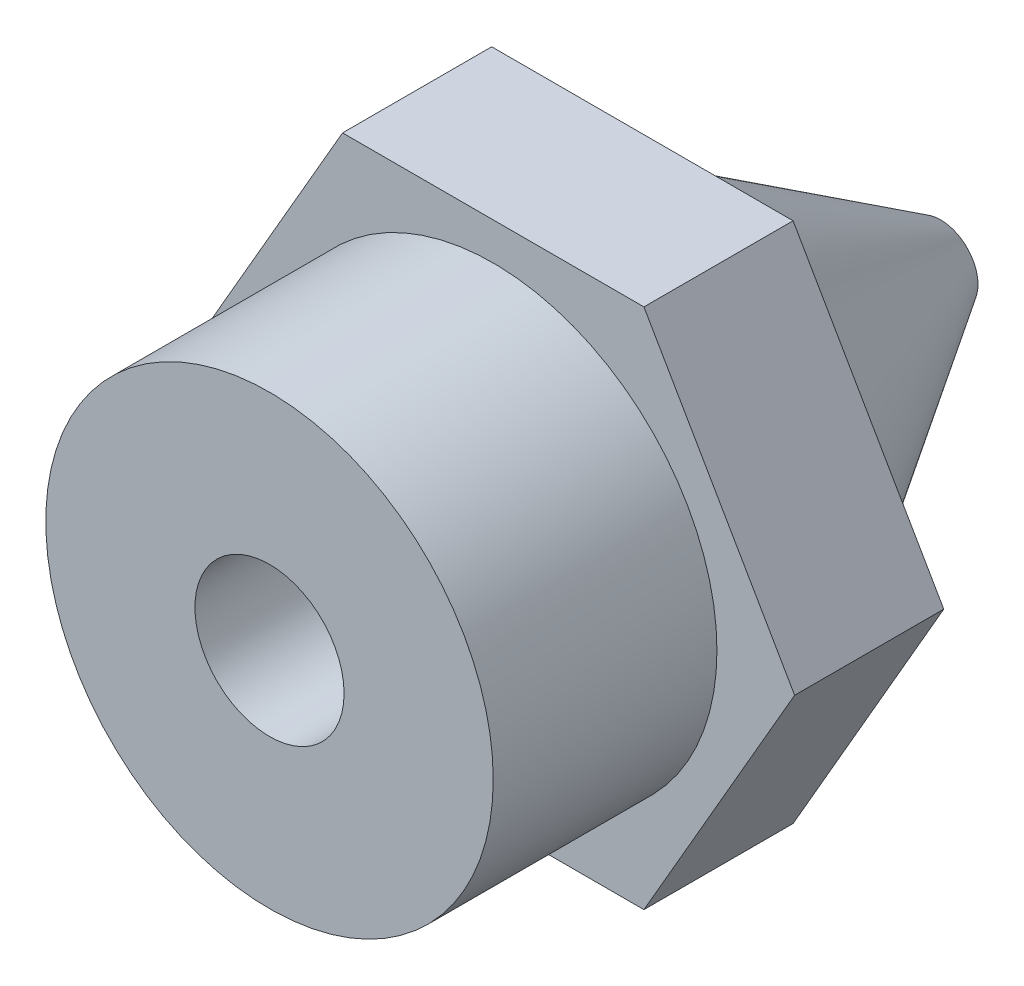
ISO-10303-21;
HEADER;
FILE_DESCRIPTION(('STEP AP214'),'2;1');
FILE_NAME('part.step','',(''),(''),'','','');
FILE_SCHEMA(('AUTOMOTIVE_DESIGN { 1 0 10303 214 1 1 1 1 }'));
ENDSEC;
DATA;
#1=APPLICATION_CONTEXT('core data for automotive mechanical design processes');
#2=APPLICATION_PROTOCOL_DEFINITION('international standard','automotive_design',2000,#1);
#3=PRODUCT_CONTEXT('',#1,'mechanical');
#4=PRODUCT('Part','Part','',(#3));
#5=PRODUCT_RELATED_PRODUCT_CATEGORY('part','',(#4));
#6=PRODUCT_DEFINITION_FORMATION('','',#4);
#7=PRODUCT_DEFINITION_CONTEXT('part definition',#1,'design');
#8=PRODUCT_DEFINITION('design','',#6,#7);
#9=PRODUCT_DEFINITION_SHAPE('','',#8);
#10=(LENGTH_UNIT() NAMED_UNIT(*) SI_UNIT(.MILLI.,.METRE.));
#11=(NAMED_UNIT(*) PLANE_ANGLE_UNIT() SI_UNIT($,.RADIAN.));
#12=(NAMED_UNIT(*) SI_UNIT($,.STERADIAN.) SOLID_ANGLE_UNIT());
#13=UNCERTAINTY_MEASURE_WITH_UNIT(LENGTH_MEASURE(1.E-05),#10,'distance_accuracy_value','');
#14=(GEOMETRIC_REPRESENTATION_CONTEXT(3) GLOBAL_UNCERTAINTY_ASSIGNED_CONTEXT((#13)) GLOBAL_UNIT_ASSIGNED_CONTEXT((#10,
#11,#12)) REPRESENTATION_CONTEXT('',''));
#15=CARTESIAN_POINT('',(0.,0.,0.));
#16=DIRECTION('',(0.,0.,1.));
#17=DIRECTION('',(1.,0.,0.));
#18=AXIS2_PLACEMENT_3D('',#15,#16,#17);
#19=CARTESIAN_POINT('',(2.02072594216368,3.50000000000001,9.));
#20=DIRECTION('',(0.,-1.,0.));
#21=DIRECTION('',(1.,0.,0.));
#22=AXIS2_PLACEMENT_3D('',#19,#20,#21);
#23=PLANE('',#22);
#24=DIRECTION('',(1.,0.,0.));
#25=VECTOR('',#24,1.);
#26=CARTESIAN_POINT('',(2.02072594216368,3.50000000000001,4.));
#27=LINE('',#26,#25);
#28=CARTESIAN_POINT('',(-2.02072594216371,3.49999999999999,4.));
#29=VERTEX_POINT('',#28);
#30=CARTESIAN_POINT('',(2.02072594216368,3.50000000000001,4.));
#31=VERTEX_POINT('',#30);
#32=EDGE_CURVE('E49',#29,#31,#27,.T.);
#33=ORIENTED_EDGE('',*,*,#32,.F.);
#34=DIRECTION('',(0.,0.,-1.));
#35=VECTOR('',#34,1.);
#36=CARTESIAN_POINT('',(-2.02072594216371,3.49999999999999,9.));
#37=LINE('',#36,#35);
#38=CARTESIAN_POINT('',(-2.02072594216371,3.49999999999999,6.));
#39=VERTEX_POINT('',#38);
#40=EDGE_CURVE('E117',#39,#29,#37,.T.);
#41=ORIENTED_EDGE('',*,*,#40,.F.);
#42=DIRECTION('',(-1.,0.,0.));
#43=VECTOR('',#42,1.);
#44=CARTESIAN_POINT('',(2.02072594216368,3.50000000000001,6.));
#45=LINE('',#44,#43);
#46=CARTESIAN_POINT('',(2.02072594216368,3.50000000000001,6.));
#47=VERTEX_POINT('',#46);
#48=EDGE_CURVE('E108',#47,#39,#45,.T.);
#49=ORIENTED_EDGE('',*,*,#48,.F.);
#50=DIRECTION('',(0.,0.,-1.));
#51=VECTOR('',#50,1.);
#52=CARTESIAN_POINT('',(2.02072594216368,3.50000000000001,9.));
#53=LINE('',#52,#51);
#54=EDGE_CURVE('E104',#47,#31,#53,.T.);
#55=ORIENTED_EDGE('',*,*,#54,.T.);
#56=EDGE_LOOP('',(#33,#41,#49,#55));
#57=FACE_BOUND('',#56,.T.);
#58=ADVANCED_FACE('F34',(#57),#23,.F.);
#59=CARTESIAN_POINT('',(-2.02072594216371,3.49999999999999,9.));
#60=DIRECTION('',(0.866025403784441,-0.499999999999995,0.));
#61=DIRECTION('',(0.499999999999995,0.866025403784442,0.));
#62=AXIS2_PLACEMENT_3D('',#59,#60,#61);
#63=PLANE('',#62);
#64=DIRECTION('',(0.499999999999995,0.866025403784442,0.));
#65=VECTOR('',#64,1.);
#66=CARTESIAN_POINT('',(-2.02072594216371,3.49999999999999,4.));
#67=LINE('',#66,#65);
#68=CARTESIAN_POINT('',(-4.04145188432738,0.,4.));
#69=VERTEX_POINT('',#68);
#70=EDGE_CURVE('E140',#69,#29,#67,.T.);
#71=ORIENTED_EDGE('',*,*,#70,.F.);
#72=DIRECTION('',(0.,0.,-1.));
#73=VECTOR('',#72,1.);
#74=CARTESIAN_POINT('',(-4.04145188432738,0.,9.));
#75=LINE('',#74,#73);
#76=CARTESIAN_POINT('',(-4.04145188432738,0.,6.));
#77=VERTEX_POINT('',#76);
#78=EDGE_CURVE('E114',#77,#69,#75,.T.);
#79=ORIENTED_EDGE('',*,*,#78,.F.);
#80=DIRECTION('',(-0.499999999999995,-0.866025403784442,0.));
#81=VECTOR('',#80,1.);
#82=CARTESIAN_POINT('',(-2.02072594216371,3.49999999999999,6.));
#83=LINE('',#82,#81);
#84=EDGE_CURVE('E125',#39,#77,#83,.T.);
#85=ORIENTED_EDGE('',*,*,#84,.F.);
#86=ORIENTED_EDGE('',*,*,#40,.T.);
#87=EDGE_LOOP('',(#71,#79,#85,#86));
#88=FACE_BOUND('',#87,.T.);
#89=ADVANCED_FACE('F177',(#88),#63,.F.);
#90=CARTESIAN_POINT('',(-4.04145188432738,0.,9.));
#91=DIRECTION('',(0.866025403784434,0.500000000000007,0.));
#92=DIRECTION('',(-0.500000000000007,0.866025403784435,0.));
#93=AXIS2_PLACEMENT_3D('',#90,#91,#92);
#94=PLANE('',#93);
#95=DIRECTION('',(-0.500000000000007,0.866025403784435,0.));
#96=VECTOR('',#95,1.);
#97=CARTESIAN_POINT('',(-4.04145188432738,0.,4.));
#98=LINE('',#97,#96);
#99=CARTESIAN_POINT('',(-2.02072594216366,-3.50000000000002,4.));
#100=VERTEX_POINT('',#99);
#101=EDGE_CURVE('E142',#100,#69,#98,.T.);
#102=ORIENTED_EDGE('',*,*,#101,.F.);
#103=DIRECTION('',(0.,0.,-1.));
#104=VECTOR('',#103,1.);
#105=CARTESIAN_POINT('',(-2.02072594216366,-3.50000000000002,9.));
#106=LINE('',#105,#104);
#107=CARTESIAN_POINT('',(-2.02072594216366,-3.50000000000002,6.));
#108=VERTEX_POINT('',#107);
#109=EDGE_CURVE('E106',#108,#100,#106,.T.);
#110=ORIENTED_EDGE('',*,*,#109,.F.);
#111=DIRECTION('',(0.500000000000007,-0.866025403784435,0.));
#112=VECTOR('',#111,1.);
#113=CARTESIAN_POINT('',(-4.04145188432738,0.,6.));
#114=LINE('',#113,#112);
#115=EDGE_CURVE('E126',#77,#108,#114,.T.);
#116=ORIENTED_EDGE('',*,*,#115,.F.);
#117=ORIENTED_EDGE('',*,*,#78,.T.);
#118=EDGE_LOOP('',(#102,#110,#116,#117));
#119=FACE_BOUND('',#118,.T.);
#120=ADVANCED_FACE('F181',(#119),#94,.F.);
#121=CARTESIAN_POINT('',(-2.02072594216366,-3.50000000000002,9.));
#122=DIRECTION('',(0.,1.,0.));
#123=DIRECTION('',(-1.,0.,0.));
#124=AXIS2_PLACEMENT_3D('',#121,#122,#123);
#125=PLANE('',#124);
#126=DIRECTION('',(-1.,0.,0.));
#127=VECTOR('',#126,1.);
#128=CARTESIAN_POINT('',(-2.02072594216366,-3.50000000000002,4.));
#129=LINE('',#128,#127);
#130=CARTESIAN_POINT('',(2.02072594216373,-3.49999999999998,4.));
#131=VERTEX_POINT('',#130);
#132=EDGE_CURVE('E100',#131,#100,#129,.T.);
#133=ORIENTED_EDGE('',*,*,#132,.F.);
#134=DIRECTION('',(0.,0.,-1.));
#135=VECTOR('',#134,1.);
#136=CARTESIAN_POINT('',(2.02072594216373,-3.49999999999998,9.));
#137=LINE('',#136,#135);
#138=CARTESIAN_POINT('',(2.02072594216373,-3.49999999999998,6.));
#139=VERTEX_POINT('',#138);
#140=EDGE_CURVE('E99',#139,#131,#137,.T.);
#141=ORIENTED_EDGE('',*,*,#140,.F.);
#142=DIRECTION('',(1.,0.,0.));
#143=VECTOR('',#142,1.);
#144=CARTESIAN_POINT('',(-2.02072594216366,-3.50000000000002,6.));
#145=LINE('',#144,#143);
#146=EDGE_CURVE('E130',#108,#139,#145,.T.);
#147=ORIENTED_EDGE('',*,*,#146,.F.);
#148=ORIENTED_EDGE('',*,*,#109,.T.);
#149=EDGE_LOOP('',(#133,#141,#147,#148));
#150=FACE_BOUND('',#149,.T.);
#151=ADVANCED_FACE('F187',(#150),#125,.F.);
#152=CARTESIAN_POINT('',(2.02072594216373,-3.49999999999998,9.));
#153=DIRECTION('',(-0.866025403784442,0.499999999999995,0.));
#154=DIRECTION('',(-0.499999999999995,-0.866025403784442,0.));
#155=AXIS2_PLACEMENT_3D('',#152,#153,#154);
#156=PLANE('',#155);
#157=DIRECTION('',(-0.499999999999995,-0.866025403784442,0.));
#158=VECTOR('',#157,1.);
#159=CARTESIAN_POINT('',(2.02072594216373,-3.49999999999998,4.));
#160=LINE('',#159,#158);
#161=CARTESIAN_POINT('',(4.04145188432738,0.,4.));
#162=VERTEX_POINT('',#161);
#163=EDGE_CURVE('E86',#162,#131,#160,.T.);
#164=ORIENTED_EDGE('',*,*,#163,.F.);
#165=DIRECTION('',(0.,0.,-1.));
#166=VECTOR('',#165,1.);
#167=CARTESIAN_POINT('',(4.04145188432738,0.,9.));
#168=LINE('',#167,#166);
#169=CARTESIAN_POINT('',(4.04145188432738,0.,6.));
#170=VERTEX_POINT('',#169);
#171=EDGE_CURVE('E97',#170,#162,#168,.T.);
#172=ORIENTED_EDGE('',*,*,#171,.F.);
#173=DIRECTION('',(0.499999999999995,0.866025403784442,0.));
#174=VECTOR('',#173,1.);
#175=CARTESIAN_POINT('',(2.02072594216373,-3.49999999999998,6.));
#176=LINE('',#175,#174);
#177=EDGE_CURVE('E57',#139,#170,#176,.T.);
#178=ORIENTED_EDGE('',*,*,#177,.F.);
#179=ORIENTED_EDGE('',*,*,#140,.T.);
#180=EDGE_LOOP('',(#164,#172,#178,#179));
#181=FACE_BOUND('',#180,.T.);
#182=ADVANCED_FACE('F96',(#181),#156,.F.);
#183=CARTESIAN_POINT('',(4.04145188432738,0.,9.));
#184=DIRECTION('',(-0.866025403784438,-0.500000000000001,0.));
#185=DIRECTION('',(0.500000000000001,-0.866025403784438,0.));
#186=AXIS2_PLACEMENT_3D('',#183,#184,#185);
#187=PLANE('',#186);
#188=DIRECTION('',(0.500000000000001,-0.866025403784438,0.));
#189=VECTOR('',#188,1.);
#190=CARTESIAN_POINT('',(4.04145188432738,0.,4.));
#191=LINE('',#190,#189);
#192=EDGE_CURVE('E42',#31,#162,#191,.T.);
#193=ORIENTED_EDGE('',*,*,#192,.F.);
#194=ORIENTED_EDGE('',*,*,#54,.F.);
#195=DIRECTION('',(-0.500000000000001,0.866025403784438,0.));
#196=VECTOR('',#195,1.);
#197=CARTESIAN_POINT('',(4.04145188432738,0.,6.));
#198=LINE('',#197,#196);
#199=EDGE_CURVE('E92',#170,#47,#198,.T.);
#200=ORIENTED_EDGE('',*,*,#199,.F.);
#201=ORIENTED_EDGE('',*,*,#171,.T.);
#202=EDGE_LOOP('',(#193,#194,#200,#201));
#203=FACE_BOUND('',#202,.T.);
#204=ADVANCED_FACE('F103',(#203),#187,.F.);
#205=CARTESIAN_POINT('',(0.,0.,6.));
#206=DIRECTION('',(0.,0.,1.));
#207=DIRECTION('',(1.,0.,0.));
#208=AXIS2_PLACEMENT_3D('',#205,#206,#207);
#209=PLANE('',#208);
#210=CARTESIAN_POINT('',(0.,0.,6.));
#211=DIRECTION('',(0.,0.,1.));
#212=DIRECTION('',(1.,0.,0.));
#213=AXIS2_PLACEMENT_3D('',#210,#211,#212);
#214=CIRCLE('',#213,3.);
#215=CARTESIAN_POINT('',(3.,0.,6.));
#216=VERTEX_POINT('',#215);
#217=EDGE_CURVE('E133',#216,#216,#214,.T.);
#218=ORIENTED_EDGE('',*,*,#217,.F.);
#219=EDGE_LOOP('',(#218));
#220=FACE_BOUND('',#219,.T.);
#221=ORIENTED_EDGE('',*,*,#48,.T.);
#222=ORIENTED_EDGE('',*,*,#84,.T.);
#223=ORIENTED_EDGE('',*,*,#115,.T.);
#224=ORIENTED_EDGE('',*,*,#146,.T.);
#225=ORIENTED_EDGE('',*,*,#177,.T.);
#226=ORIENTED_EDGE('',*,*,#199,.T.);
#227=EDGE_LOOP('',(#221,#222,#223,#224,#225,#226));
#228=FACE_BOUND('',#227,.T.);
#229=ADVANCED_FACE('F121',(#220,#228),#209,.T.);
#230=CARTESIAN_POINT('',(0.,0.,6.));
#231=DIRECTION('',(0.,0.,1.));
#232=DIRECTION('',(1.,0.,0.));
#233=AXIS2_PLACEMENT_3D('',#230,#231,#232);
#234=CYLINDRICAL_SURFACE('',#233,3.);
#235=ORIENTED_EDGE('',*,*,#217,.T.);
#236=EDGE_LOOP('',(#235));
#237=FACE_BOUND('',#236,.T.);
#238=CARTESIAN_POINT('',(0.,0.,9.));
#239=DIRECTION('',(0.,0.,1.));
#240=DIRECTION('',(1.,0.,0.));
#241=AXIS2_PLACEMENT_3D('',#238,#239,#240);
#242=CIRCLE('',#241,3.);
#243=CARTESIAN_POINT('',(3.,0.,9.));
#244=VERTEX_POINT('',#243);
#245=EDGE_CURVE('E134',#244,#244,#242,.T.);
#246=ORIENTED_EDGE('',*,*,#245,.F.);
#247=EDGE_LOOP('',(#246));
#248=FACE_BOUND('',#247,.T.);
#249=ADVANCED_FACE('F162',(#237,#248),#234,.T.);
#250=CARTESIAN_POINT('',(0.,0.,9.));
#251=DIRECTION('',(0.,0.,1.));
#252=DIRECTION('',(1.,0.,0.));
#253=AXIS2_PLACEMENT_3D('',#250,#251,#252);
#254=PLANE('',#253);
#255=CARTESIAN_POINT('',(0.,0.,9.));
#256=DIRECTION('',(0.,0.,1.));
#257=DIRECTION('',(1.,0.,0.));
#258=AXIS2_PLACEMENT_3D('',#255,#256,#257);
#259=CIRCLE('',#258,1.);
#260=CARTESIAN_POINT('',(1.,0.,9.));
#261=VERTEX_POINT('',#260);
#262=EDGE_CURVE('E153',#261,#261,#259,.T.);
#263=ORIENTED_EDGE('',*,*,#262,.F.);
#264=EDGE_LOOP('',(#263));
#265=FACE_BOUND('',#264,.T.);
#266=ORIENTED_EDGE('',*,*,#245,.T.);
#267=EDGE_LOOP('',(#266));
#268=FACE_BOUND('',#267,.T.);
#269=ADVANCED_FACE('F159',(#265,#268),#254,.T.);
#270=CARTESIAN_POINT('',(0.,0.,4.));
#271=DIRECTION('',(0.,0.,-1.));
#272=DIRECTION('',(-1.,0.,0.));
#273=AXIS2_PLACEMENT_3D('',#270,#271,#272);
#274=PLANE('',#273);
#275=CARTESIAN_POINT('',(0.,0.,4.));
#276=DIRECTION('',(0.,0.,-1.));
#277=DIRECTION('',(-1.,0.,0.));
#278=AXIS2_PLACEMENT_3D('',#275,#276,#277);
#279=CIRCLE('',#278,3.);
#280=CARTESIAN_POINT('',(2.99999999999998,0.,4.));
#281=VERTEX_POINT('',#280);
#282=EDGE_CURVE('E101',#281,#281,#279,.T.);
#283=ORIENTED_EDGE('',*,*,#282,.F.);
#284=EDGE_LOOP('',(#283));
#285=FACE_BOUND('',#284,.T.);
#286=ORIENTED_EDGE('',*,*,#32,.T.);
#287=ORIENTED_EDGE('',*,*,#192,.T.);
#288=ORIENTED_EDGE('',*,*,#163,.T.);
#289=ORIENTED_EDGE('',*,*,#132,.T.);
#290=ORIENTED_EDGE('',*,*,#101,.T.);
#291=ORIENTED_EDGE('',*,*,#70,.T.);
#292=EDGE_LOOP('',(#286,#287,#288,#289,#290,#291));
#293=FACE_BOUND('',#292,.T.);
#294=ADVANCED_FACE('F85',(#285,#293),#274,.T.);
#295=CARTESIAN_POINT('',(0.,0.,0.));
#296=DIRECTION('',(0.,0.,1.));
#297=DIRECTION('',(1.,0.,0.));
#298=AXIS2_PLACEMENT_3D('',#295,#296,#297);
#299=PLANE('',#298);
#300=CARTESIAN_POINT('',(0.,0.,0.));
#301=DIRECTION('',(0.,0.,1.));
#302=DIRECTION('',(1.,0.,0.));
#303=AXIS2_PLACEMENT_3D('',#300,#301,#302);
#304=CIRCLE('',#303,0.250000000000001);
#305=CARTESIAN_POINT('',(0.25,0.,0.));
#306=VERTEX_POINT('',#305);
#307=EDGE_CURVE('E147',#306,#306,#304,.T.);
#308=ORIENTED_EDGE('',*,*,#307,.T.);
#309=EDGE_LOOP('',(#308));
#310=FACE_BOUND('',#309,.T.);
#311=CARTESIAN_POINT('',(0.,0.,0.));
#312=DIRECTION('',(0.,0.,1.));
#313=DIRECTION('',(1.,0.,0.));
#314=AXIS2_PLACEMENT_3D('',#311,#312,#313);
#315=CIRCLE('',#314,0.500522592362688);
#316=CARTESIAN_POINT('',(0.500522592362688,0.,0.));
#317=VERTEX_POINT('',#316);
#318=EDGE_CURVE('E11',#317,#317,#315,.F.);
#319=ORIENTED_EDGE('',*,*,#318,.T.);
#320=EDGE_LOOP('',(#319));
#321=FACE_BOUND('',#320,.T.);
#322=ADVANCED_FACE('F196',(#310,#321),#299,.F.);
#323=CARTESIAN_POINT('',(0.,0.,0.));
#324=DIRECTION('',(0.,0.,1.));
#325=DIRECTION('',(1.,0.,0.));
#326=AXIS2_PLACEMENT_3D('',#323,#324,#325);
#327=CONICAL_SURFACE('',#326,0.500522592362688,0.558505360638183);
#328=CARTESIAN_POINT('',(2.99999999999998,0.,4.));
#329=CARTESIAN_POINT('',(2.97396377700376,0.,3.95833333333333));
#330=CARTESIAN_POINT('',(2.94792755400754,0.,3.91666666666667));
#331=CARTESIAN_POINT('',(2.8958551080151,0.,3.83333333333333));
#332=CARTESIAN_POINT('',(2.86981888501887,0.,3.79166666666667));
#333=CARTESIAN_POINT('',(2.81774643902643,0.,3.70833333333333));
#334=CARTESIAN_POINT('',(2.79171021603021,0.,3.66666666666667));
#335=CARTESIAN_POINT('',(2.73963777003777,0.,3.58333333333333));
#336=CARTESIAN_POINT('',(2.71360154704154,0.,3.54166666666667));
#337=CARTESIAN_POINT('',(2.6615291010491,0.,3.45833333333333));
#338=CARTESIAN_POINT('',(2.63549287805288,0.,3.41666666666667));
#339=CARTESIAN_POINT('',(2.58342043206043,0.,3.33333333333333));
#340=CARTESIAN_POINT('',(2.55738420906421,0.,3.29166666666667));
#341=CARTESIAN_POINT('',(2.50531176307177,0.,3.20833333333333));
#342=CARTESIAN_POINT('',(2.47927554007555,0.,3.16666666666667));
#343=CARTESIAN_POINT('',(2.4272030940831,0.,3.08333333333333));
#344=CARTESIAN_POINT('',(2.40116687108688,0.,3.04166666666667));
#345=CARTESIAN_POINT('',(2.34909442509444,0.,2.95833333333333));
#346=CARTESIAN_POINT('',(2.32305820209822,0.,2.91666666666667));
#347=CARTESIAN_POINT('',(2.27098575610577,0.,2.83333333333333));
#348=CARTESIAN_POINT('',(2.24494953310955,0.,2.79166666666667));
#349=CARTESIAN_POINT('',(2.19287708711711,0.,2.70833333333333));
#350=CARTESIAN_POINT('',(2.16684086412088,0.,2.66666666666667));
#351=CARTESIAN_POINT('',(2.11476841812844,0.,2.58333333333333));
#352=CARTESIAN_POINT('',(2.08873219513222,0.,2.54166666666667));
#353=CARTESIAN_POINT('',(2.03665974913978,0.,2.45833333333333));
#354=CARTESIAN_POINT('',(2.01062352614355,0.,2.41666666666667));
#355=CARTESIAN_POINT('',(1.95855108015111,0.,2.33333333333333));
#356=CARTESIAN_POINT('',(1.93251485715489,0.,2.29166666666667));
#357=CARTESIAN_POINT('',(1.88044241116245,0.,2.20833333333333));
#358=CARTESIAN_POINT('',(1.85440618816622,0.,2.16666666666667));
#359=CARTESIAN_POINT('',(1.80233374217378,0.,2.08333333333333));
#360=CARTESIAN_POINT('',(1.77629751917756,0.,2.04166666666667));
#361=CARTESIAN_POINT('',(1.72422507318511,0.,1.95833333333333));
#362=CARTESIAN_POINT('',(1.69818885018889,0.,1.91666666666667));
#363=CARTESIAN_POINT('',(1.64611640419645,0.,1.83333333333333));
#364=CARTESIAN_POINT('',(1.62008018120023,0.,1.79166666666667));
#365=CARTESIAN_POINT('',(1.56800773520778,0.,1.70833333333333));
#366=CARTESIAN_POINT('',(1.54197151221156,0.,1.66666666666667));
#367=CARTESIAN_POINT('',(1.48989906621912,0.,1.58333333333333));
#368=CARTESIAN_POINT('',(1.4638628432229,0.,1.54166666666667));
#369=CARTESIAN_POINT('',(1.41179039723045,0.,1.45833333333333));
#370=CARTESIAN_POINT('',(1.38575417423423,0.,1.41666666666667));
#371=CARTESIAN_POINT('',(1.33368172824179,0.,1.33333333333333));
#372=CARTESIAN_POINT('',(1.30764550524556,0.,1.29166666666667));
#373=CARTESIAN_POINT('',(1.25557305925312,0.,1.20833333333333));
#374=CARTESIAN_POINT('',(1.2295368362569,0.,1.16666666666667));
#375=CARTESIAN_POINT('',(1.17746439026446,0.,1.08333333333333));
#376=CARTESIAN_POINT('',(1.15142816726823,0.,1.04166666666667));
#377=CARTESIAN_POINT('',(1.09935572127579,0.,0.958333333333333));
#378=CARTESIAN_POINT('',(1.07331949827957,0.,0.916666666666667));
#379=CARTESIAN_POINT('',(1.02124705228712,0.,0.833333333333333));
#380=CARTESIAN_POINT('',(0.995210829290903,0.,0.791666666666667));
#381=CARTESIAN_POINT('',(0.943138383298459,0.,0.708333333333333));
#382=CARTESIAN_POINT('',(0.917102160302237,0.,0.666666666666667));
#383=CARTESIAN_POINT('',(0.865029714309794,0.,0.583333333333333));
#384=CARTESIAN_POINT('',(0.838993491313572,0.,0.541666666666667));
#385=CARTESIAN_POINT('',(0.786921045321128,0.,0.458333333333333));
#386=CARTESIAN_POINT('',(0.760884822324907,0.,0.416666666666667));
#387=CARTESIAN_POINT('',(0.708812376332463,0.,0.333333333333333));
#388=CARTESIAN_POINT('',(0.682776153336241,0.,0.291666666666667));
#389=CARTESIAN_POINT('',(0.630703707343798,0.,0.208333333333333));
#390=CARTESIAN_POINT('',(0.604667484347576,0.,0.166666666666667));
#391=CARTESIAN_POINT('',(0.552595038355132,0.,0.0833333333333335));
#392=CARTESIAN_POINT('',(0.52655881535891,0.,0.0416666666666668));
#393=CARTESIAN_POINT('',(0.500522592362688,0.,0.));
#394=B_SPLINE_CURVE_WITH_KNOTS('',3,(#328,#329,#330,#331,#332,#333,#334,#335,#336,#337,#338,
#339,#340,#341,#342,#343,#344,#345,#346,#347,#348,#349,#350,#351,#352,#353,#354,#355,#356,#357,
#358,#359,#360,#361,#362,#363,#364,#365,#366,#367,#368,#369,#370,#371,#372,#373,#374,#375,#376,
#377,#378,#379,#380,#381,#382,#383,#384,#385,#386,#387,#388,#389,#390,#391,#392,#393),
.UNSPECIFIED.,.F.,.F.,(4,2,2,2,2,2,2,2,2,2,2,2,2,2,2,2,2,2,2,2,2,2,2,2,2,2,2,2,2,2,2,2,4),(0.,
0.147397300420262,0.294794600840524,0.442191901260785,0.589589201681047,0.736986502101309,
0.884383802521571,1.03178110294183,1.17917840336209,1.32657570378236,1.47397300420262,
1.62137030462288,1.76876760504314,1.9161649054634,2.06356220588366,2.21095950630393,
2.35835680672419,2.50575410714445,2.65315140756471,2.80054870798497,2.94794600840524,
3.0953433088255,3.24274060924576,3.39013790966602,3.53753521008628,3.68493251050655,
3.83232981092681,3.97972711134707,4.12712441176733,4.27452171218759,4.42191901260786,
4.56931631302812,4.71671361344838),.UNSPECIFIED.);
#395=EDGE_CURVE('BSEAM36',#281,#317,#394,.T.);
#396=ORIENTED_EDGE('',*,*,#282,.T.);
#397=ORIENTED_EDGE('',*,*,#318,.F.);
#398=ORIENTED_EDGE('',*,*,#395,.T.);
#399=ORIENTED_EDGE('',*,*,#395,.F.);
#400=EDGE_LOOP('',(#396,#398,#397,#399));
#401=FACE_BOUND('',#400,.T.);
#402=ADVANCED_FACE('F36',(#401),#327,.T.);
#403=CARTESIAN_POINT('',(0.,0.,6.10825982098128));
#404=DIRECTION('',(0.,0.,1.));
#405=DIRECTION('',(1.,0.,0.));
#406=AXIS2_PLACEMENT_3D('',#403,#404,#405);
#407=CONICAL_SURFACE('',#406,1.,0.122173047639596);
#408=CARTESIAN_POINT('',(0.,0.,6.10825982098128));
#409=DIRECTION('',(0.,0.,1.));
#410=DIRECTION('',(1.,0.,0.));
#411=AXIS2_PLACEMENT_3D('',#408,#409,#410);
#412=CIRCLE('',#411,1.);
#413=CARTESIAN_POINT('',(1.,0.,6.10825982098128));
#414=VERTEX_POINT('',#413);
#415=EDGE_CURVE('E150',#414,#414,#412,.T.);
#416=CARTESIAN_POINT('',(0.25,0.,0.));
#417=CARTESIAN_POINT('',(0.2578125,0.,0.0636277064685542));
#418=CARTESIAN_POINT('',(0.265625,0.,0.127255412937109));
#419=CARTESIAN_POINT('',(0.28125,0.,0.254510825874219));
#420=CARTESIAN_POINT('',(0.2890625,0.,0.318138532342775));
#421=CARTESIAN_POINT('',(0.3046875,0.,0.445393945279885));
#422=CARTESIAN_POINT('',(0.3125,0.,0.50902165174844));
#423=CARTESIAN_POINT('',(0.328125,0.,0.63627706468555));
#424=CARTESIAN_POINT('',(0.3359375,0.,0.699904771154104));
#425=CARTESIAN_POINT('',(0.3515625,0.,0.827160184091214));
#426=CARTESIAN_POINT('',(0.359375,0.,0.890787890559769));
#427=CARTESIAN_POINT('',(0.375,0.,1.01804330349688));
#428=CARTESIAN_POINT('',(0.3828125,0.,1.08167100996543));
#429=CARTESIAN_POINT('',(0.3984375,0.,1.20892642290254));
#430=CARTESIAN_POINT('',(0.40625,0.,1.2725541293711));
#431=CARTESIAN_POINT('',(0.421875,0.,1.39980954230821));
#432=CARTESIAN_POINT('',(0.4296875,0.,1.46343724877677));
#433=CARTESIAN_POINT('',(0.4453125,0.,1.59069266171388));
#434=CARTESIAN_POINT('',(0.453125,0.,1.65432036818243));
#435=CARTESIAN_POINT('',(0.46875,0.,1.78157578111954));
#436=CARTESIAN_POINT('',(0.4765625,0.,1.84520348758809));
#437=CARTESIAN_POINT('',(0.4921875,0.,1.97245890052521));
#438=CARTESIAN_POINT('',(0.5,0.,2.03608660699376));
#439=CARTESIAN_POINT('',(0.515625,0.,2.16334201993087));
#440=CARTESIAN_POINT('',(0.5234375,0.,2.22696972639943));
#441=CARTESIAN_POINT('',(0.5390625,0.,2.35422513933654));
#442=CARTESIAN_POINT('',(0.546875,0.,2.41785284580509));
#443=CARTESIAN_POINT('',(0.5625,0.,2.5451082587422));
#444=CARTESIAN_POINT('',(0.5703125,0.,2.60873596521076));
#445=CARTESIAN_POINT('',(0.5859375,0.,2.73599137814787));
#446=CARTESIAN_POINT('',(0.59375,0.,2.79961908461642));
#447=CARTESIAN_POINT('',(0.609375,0.,2.92687449755353));
#448=CARTESIAN_POINT('',(0.6171875,0.,2.99050220402209));
#449=CARTESIAN_POINT('',(0.6328125,0.,3.1177576169592));
#450=CARTESIAN_POINT('',(0.640625,0.,3.18138532342775));
#451=CARTESIAN_POINT('',(0.65625,0.,3.30864073636486));
#452=CARTESIAN_POINT('',(0.6640625,0.,3.37226844283342));
#453=CARTESIAN_POINT('',(0.6796875,0.,3.49952385577053));
#454=CARTESIAN_POINT('',(0.6875,0.,3.56315156223908));
#455=CARTESIAN_POINT('',(0.703125,0.,3.69040697517619));
#456=CARTESIAN_POINT('',(0.7109375,0.,3.75403468164475));
#457=CARTESIAN_POINT('',(0.7265625,0.,3.88129009458186));
#458=CARTESIAN_POINT('',(0.734375,0.,3.94491780105041));
#459=CARTESIAN_POINT('',(0.75,0.,4.07217321398752));
#460=CARTESIAN_POINT('',(0.7578125,0.,4.13580092045608));
#461=CARTESIAN_POINT('',(0.7734375,0.,4.26305633339319));
#462=CARTESIAN_POINT('',(0.78125,0.,4.32668403986174));
#463=CARTESIAN_POINT('',(0.796875,0.,4.45393945279885));
#464=CARTESIAN_POINT('',(0.8046875,0.,4.51756715926741));
#465=CARTESIAN_POINT('',(0.8203125,0.,4.64482257220452));
#466=CARTESIAN_POINT('',(0.828125,0.,4.70845027867307));
#467=CARTESIAN_POINT('',(0.84375,0.,4.83570569161018));
#468=CARTESIAN_POINT('',(0.8515625,0.,4.89933339807874));
#469=CARTESIAN_POINT('',(0.8671875,0.,5.02658881101585));
#470=CARTESIAN_POINT('',(0.875,0.,5.0902165174844));
#471=CARTESIAN_POINT('',(0.890625,0.,5.21747193042151));
#472=CARTESIAN_POINT('',(0.8984375,0.,5.28109963689007));
#473=CARTESIAN_POINT('',(0.9140625,0.,5.40835504982718));
#474=CARTESIAN_POINT('',(0.921875,0.,5.47198275629573));
#475=CARTESIAN_POINT('',(0.9375,0.,5.59923816923284));
#476=CARTESIAN_POINT('',(0.9453125,0.,5.6628658757014));
#477=CARTESIAN_POINT('',(0.9609375,0.,5.79012128863851));
#478=CARTESIAN_POINT('',(0.96875,0.,5.85374899510706));
#479=CARTESIAN_POINT('',(0.984375,0.,5.98100440804417));
#480=CARTESIAN_POINT('',(0.9921875,0.,6.04463211451273));
#481=CARTESIAN_POINT('',(1.,0.,6.10825982098128));
#482=B_SPLINE_CURVE_WITH_KNOTS('',3,(#416,#417,#418,#419,#420,#421,#422,#423,#424,#425,#426,
#427,#428,#429,#430,#431,#432,#433,#434,#435,#436,#437,#438,#439,#440,#441,#442,#443,#444,#445,
#446,#447,#448,#449,#450,#451,#452,#453,#454,#455,#456,#457,#458,#459,#460,#461,#462,#463,#464,
#465,#466,#467,#468,#469,#470,#471,#472,#473,#474,#475,#476,#477,#478,#479,#480,#481),
.UNSPECIFIED.,.F.,.F.,(4,2,2,2,2,2,2,2,2,2,2,2,2,2,2,2,2,2,2,2,2,2,2,2,2,2,2,2,2,2,2,2,4),(0.,
0.192316618315442,0.384633236630884,0.576949854946326,0.769266473261768,0.96158309157721,
1.15389970989265,1.34621632820809,1.53853294652354,1.73084956483898,1.92316618315442,
2.11548280146986,2.3077994197853,2.50011603810075,2.69243265641619,2.88474927473163,
3.07706589304707,3.26938251136251,3.46169912967796,3.6540157479934,3.84633236630884,
4.03864898462428,4.23096560293972,4.42328222125516,4.61559883957061,4.80791545788605,
5.00023207620149,5.19254869451693,5.38486531283237,5.57718193114781,5.76949854946326,
5.9618151677787,6.15413178609414),.UNSPECIFIED.);
#483=EDGE_CURVE('BSEAM203',#306,#414,#482,.T.);
#484=ORIENTED_EDGE('',*,*,#307,.F.);
#485=ORIENTED_EDGE('',*,*,#415,.T.);
#486=ORIENTED_EDGE('',*,*,#483,.T.);
#487=ORIENTED_EDGE('',*,*,#483,.F.);
#488=EDGE_LOOP('',(#484,#486,#485,#487));
#489=FACE_BOUND('',#488,.T.);
#490=ADVANCED_FACE('F203',(#489),#407,.F.);
#491=CARTESIAN_POINT('',(0.,0.,10.3816051571313));
#492=DIRECTION('',(0.,0.,1.));
#493=DIRECTION('',(1.,0.,0.));
#494=AXIS2_PLACEMENT_3D('',#491,#492,#493);
#495=CYLINDRICAL_SURFACE('',#494,1.);
#496=ORIENTED_EDGE('',*,*,#415,.F.);
#497=EDGE_LOOP('',(#496));
#498=FACE_BOUND('',#497,.T.);
#499=ORIENTED_EDGE('',*,*,#262,.T.);
#500=EDGE_LOOP('',(#499));
#501=FACE_BOUND('',#500,.T.);
#502=ADVANCED_FACE('F157',(#498,#501),#495,.F.);
#503=CLOSED_SHELL('',(#58,#89,#120,#151,#182,#204,#229,#249,#269,#294,#322,#402,#490,#502));
#504=MANIFOLD_SOLID_BREP('B2',#503);
#505=ADVANCED_BREP_SHAPE_REPRESENTATION('',(#18,#504),#14);
#506=SHAPE_DEFINITION_REPRESENTATION(#9,#505);
ENDSEC;
END-ISO-10303-21;
